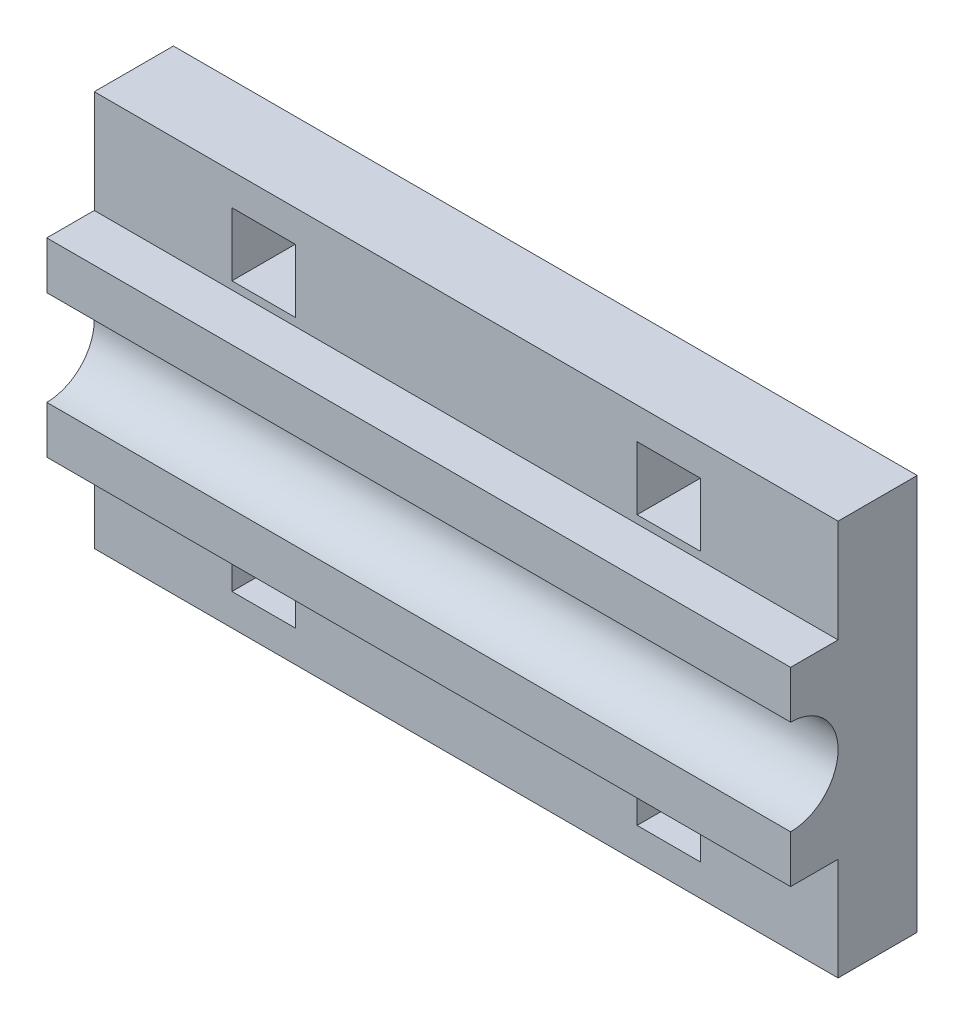
ISO-10303-21;
HEADER;
FILE_DESCRIPTION(('STEP AP214'),'2;1');
FILE_NAME('part.step','',(''),(''),'','','');
FILE_SCHEMA(('AUTOMOTIVE_DESIGN { 1 0 10303 214 1 1 1 1 }'));
ENDSEC;
DATA;
#1=APPLICATION_CONTEXT('core data for automotive mechanical design processes');
#2=APPLICATION_PROTOCOL_DEFINITION('international standard','automotive_design',2000,#1);
#3=PRODUCT_CONTEXT('',#1,'mechanical');
#4=PRODUCT('Part','Part','',(#3));
#5=PRODUCT_RELATED_PRODUCT_CATEGORY('part','',(#4));
#6=PRODUCT_DEFINITION_FORMATION('','',#4);
#7=PRODUCT_DEFINITION_CONTEXT('part definition',#1,'design');
#8=PRODUCT_DEFINITION('design','',#6,#7);
#9=PRODUCT_DEFINITION_SHAPE('','',#8);
#10=(LENGTH_UNIT() NAMED_UNIT(*) SI_UNIT(.MILLI.,.METRE.));
#11=(NAMED_UNIT(*) PLANE_ANGLE_UNIT() SI_UNIT($,.RADIAN.));
#12=(NAMED_UNIT(*) SI_UNIT($,.STERADIAN.) SOLID_ANGLE_UNIT());
#13=UNCERTAINTY_MEASURE_WITH_UNIT(LENGTH_MEASURE(1.E-05),#10,'distance_accuracy_value','');
#14=(GEOMETRIC_REPRESENTATION_CONTEXT(3) GLOBAL_UNCERTAINTY_ASSIGNED_CONTEXT((#13)) GLOBAL_UNIT_ASSIGNED_CONTEXT((#10,
#11,#12)) REPRESENTATION_CONTEXT('',''));
#15=CARTESIAN_POINT('',(0.,0.,0.));
#16=DIRECTION('',(0.,0.,1.));
#17=DIRECTION('',(1.,0.,0.));
#18=AXIS2_PLACEMENT_3D('',#15,#16,#17);
#19=CARTESIAN_POINT('',(0.,0.,8.));
#20=DIRECTION('',(0.,0.,-1.));
#21=DIRECTION('',(-1.,0.,0.));
#22=AXIS2_PLACEMENT_3D('',#19,#20,#21);
#23=PLANE('',#22);
#24=DIRECTION('',(0.,-1.,0.));
#25=VECTOR('',#24,1.);
#26=CARTESIAN_POINT('',(-36.,-13.5,8.));
#27=LINE('',#26,#25);
#28=CARTESIAN_POINT('',(-36.,-1.5,8.));
#29=VERTEX_POINT('',#28);
#30=CARTESIAN_POINT('',(-36.,-4.5,8.));
#31=VERTEX_POINT('',#30);
#32=EDGE_CURVE('E216',#29,#31,#27,.T.);
#33=ORIENTED_EDGE('',*,*,#32,.T.);
#34=DIRECTION('',(1.,0.,0.));
#35=VECTOR('',#34,1.);
#36=CARTESIAN_POINT('',(-52.,-4.5,8.));
#37=LINE('',#36,#35);
#38=CARTESIAN_POINT('',(11.,-4.5,8.));
#39=VERTEX_POINT('',#38);
#40=EDGE_CURVE('E11',#31,#39,#37,.T.);
#41=ORIENTED_EDGE('',*,*,#40,.T.);
#42=DIRECTION('',(0.,1.,0.));
#43=VECTOR('',#42,1.);
#44=CARTESIAN_POINT('',(11.,-13.5,8.));
#45=LINE('',#44,#43);
#46=CARTESIAN_POINT('',(11.,-1.5,8.));
#47=VERTEX_POINT('',#46);
#48=EDGE_CURVE('E213',#39,#47,#45,.T.);
#49=ORIENTED_EDGE('',*,*,#48,.T.);
#50=DIRECTION('',(-1.,0.,0.));
#51=VECTOR('',#50,1.);
#52=CARTESIAN_POINT('',(-36.,-1.5,8.));
#53=LINE('',#52,#51);
#54=EDGE_CURVE('E224',#47,#29,#53,.T.);
#55=ORIENTED_EDGE('',*,*,#54,.T.);
#56=EDGE_LOOP('',(#33,#41,#49,#55));
#57=FACE_BOUND('',#56,.T.);
#58=ADVANCED_FACE('F33',(#57),#23,.F.);
#59=CARTESIAN_POINT('',(0.,0.,5.));
#60=DIRECTION('',(0.,0.,1.));
#61=DIRECTION('',(1.,0.,0.));
#62=AXIS2_PLACEMENT_3D('',#59,#60,#61);
#63=PLANE('',#62);
#64=DIRECTION('',(-1.,0.,0.));
#65=VECTOR('',#64,1.);
#66=CARTESIAN_POINT('',(-36.,-1.5,5.));
#67=LINE('',#66,#65);
#68=CARTESIAN_POINT('',(11.,-1.5,5.));
#69=VERTEX_POINT('',#68);
#70=CARTESIAN_POINT('',(-36.,-1.5,5.));
#71=VERTEX_POINT('',#70);
#72=EDGE_CURVE('E56',#69,#71,#67,.T.);
#73=ORIENTED_EDGE('',*,*,#72,.F.);
#74=DIRECTION('',(0.,1.,0.));
#75=VECTOR('',#74,1.);
#76=CARTESIAN_POINT('',(11.,-20.,5.));
#77=LINE('',#76,#75);
#78=CARTESIAN_POINT('',(11.,5.,5.));
#79=VERTEX_POINT('',#78);
#80=EDGE_CURVE('E382',#69,#79,#77,.T.);
#81=ORIENTED_EDGE('',*,*,#80,.T.);
#82=DIRECTION('',(-1.,0.,0.));
#83=VECTOR('',#82,1.);
#84=CARTESIAN_POINT('',(11.,5.,5.));
#85=LINE('',#84,#83);
#86=CARTESIAN_POINT('',(-36.,4.99999999999999,5.));
#87=VERTEX_POINT('',#86);
#88=EDGE_CURVE('E373',#79,#87,#85,.T.);
#89=ORIENTED_EDGE('',*,*,#88,.T.);
#90=DIRECTION('',(0.,-1.,0.));
#91=VECTOR('',#90,1.);
#92=CARTESIAN_POINT('',(-36.,4.99999999999999,5.));
#93=LINE('',#92,#91);
#94=EDGE_CURVE('E378',#87,#71,#93,.T.);
#95=ORIENTED_EDGE('',*,*,#94,.T.);
#96=EDGE_LOOP('',(#73,#81,#89,#95));
#97=FACE_BOUND('',#96,.T.);
#98=DIRECTION('',(0.,1.,0.));
#99=VECTOR('',#98,1.);
#100=CARTESIAN_POINT('',(2.3,3.,5.));
#101=LINE('',#100,#99);
#102=CARTESIAN_POINT('',(2.3,-1.00000000000001,5.));
#103=VERTEX_POINT('',#102);
#104=CARTESIAN_POINT('',(2.3,3.,5.));
#105=VERTEX_POINT('',#104);
#106=EDGE_CURVE('E293',#103,#105,#101,.T.);
#107=ORIENTED_EDGE('',*,*,#106,.F.);
#108=DIRECTION('',(1.,0.,0.));
#109=VECTOR('',#108,1.);
#110=CARTESIAN_POINT('',(2.3,-1.00000000000001,5.));
#111=LINE('',#110,#109);
#112=CARTESIAN_POINT('',(-1.7,-1.,5.));
#113=VERTEX_POINT('',#112);
#114=EDGE_CURVE('E283',#113,#103,#111,.T.);
#115=ORIENTED_EDGE('',*,*,#114,.F.);
#116=DIRECTION('',(0.,-1.,0.));
#117=VECTOR('',#116,1.);
#118=CARTESIAN_POINT('',(-1.7,3.,5.));
#119=LINE('',#118,#117);
#120=CARTESIAN_POINT('',(-1.7,3.,5.));
#121=VERTEX_POINT('',#120);
#122=EDGE_CURVE('E299',#121,#113,#119,.T.);
#123=ORIENTED_EDGE('',*,*,#122,.F.);
#124=DIRECTION('',(-1.,0.,0.));
#125=VECTOR('',#124,1.);
#126=CARTESIAN_POINT('',(2.3,3.,5.));
#127=LINE('',#126,#125);
#128=EDGE_CURVE('E295',#105,#121,#127,.T.);
#129=ORIENTED_EDGE('',*,*,#128,.F.);
#130=EDGE_LOOP('',(#107,#115,#123,#129));
#131=FACE_BOUND('',#130,.T.);
#132=DIRECTION('',(0.,-1.,0.));
#133=VECTOR('',#132,1.);
#134=CARTESIAN_POINT('',(-27.3,3.,5.));
#135=LINE('',#134,#133);
#136=CARTESIAN_POINT('',(-27.3,3.,5.));
#137=VERTEX_POINT('',#136);
#138=CARTESIAN_POINT('',(-27.3,-1.00000000000001,5.));
#139=VERTEX_POINT('',#138);
#140=EDGE_CURVE('E259',#137,#139,#135,.T.);
#141=ORIENTED_EDGE('',*,*,#140,.F.);
#142=DIRECTION('',(-1.,0.,0.));
#143=VECTOR('',#142,1.);
#144=CARTESIAN_POINT('',(-27.3,3.,5.));
#145=LINE('',#144,#143);
#146=CARTESIAN_POINT('',(-23.3,3.,5.));
#147=VERTEX_POINT('',#146);
#148=EDGE_CURVE('E249',#147,#137,#145,.T.);
#149=ORIENTED_EDGE('',*,*,#148,.F.);
#150=DIRECTION('',(0.,1.,0.));
#151=VECTOR('',#150,1.);
#152=CARTESIAN_POINT('',(-23.3,3.,5.));
#153=LINE('',#152,#151);
#154=CARTESIAN_POINT('',(-23.3,-1.,5.));
#155=VERTEX_POINT('',#154);
#156=EDGE_CURVE('E265',#155,#147,#153,.T.);
#157=ORIENTED_EDGE('',*,*,#156,.F.);
#158=DIRECTION('',(1.,0.,0.));
#159=VECTOR('',#158,1.);
#160=CARTESIAN_POINT('',(-27.3,-1.00000000000001,5.));
#161=LINE('',#160,#159);
#162=EDGE_CURVE('E261',#139,#155,#161,.T.);
#163=ORIENTED_EDGE('',*,*,#162,.F.);
#164=EDGE_LOOP('',(#141,#149,#157,#163));
#165=FACE_BOUND('',#164,.T.);
#166=ADVANCED_FACE('F433',(#97,#131,#165),#63,.T.);
#167=CARTESIAN_POINT('',(11.,5.,5.));
#168=DIRECTION('',(0.,-1.,0.));
#169=DIRECTION('',(1.,0.,0.));
#170=AXIS2_PLACEMENT_3D('',#167,#168,#169);
#171=PLANE('',#170);
#172=DIRECTION('',(-1.,0.,0.));
#173=VECTOR('',#172,1.);
#174=CARTESIAN_POINT('',(11.,5.,0.));
#175=LINE('',#174,#173);
#176=CARTESIAN_POINT('',(11.,5.,0.));
#177=VERTEX_POINT('',#176);
#178=CARTESIAN_POINT('',(-36.,4.99999999999999,0.));
#179=VERTEX_POINT('',#178);
#180=EDGE_CURVE('E366',#177,#179,#175,.T.);
#181=ORIENTED_EDGE('',*,*,#180,.T.);
#182=DIRECTION('',(0.,0.,-1.));
#183=VECTOR('',#182,1.);
#184=CARTESIAN_POINT('',(-36.,4.99999999999999,5.));
#185=LINE('',#184,#183);
#186=EDGE_CURVE('E401',#87,#179,#185,.T.);
#187=ORIENTED_EDGE('',*,*,#186,.F.);
#188=ORIENTED_EDGE('',*,*,#88,.F.);
#189=DIRECTION('',(0.,0.,-1.));
#190=VECTOR('',#189,1.);
#191=CARTESIAN_POINT('',(11.,5.,5.));
#192=LINE('',#191,#190);
#193=EDGE_CURVE('E385',#79,#177,#192,.T.);
#194=ORIENTED_EDGE('',*,*,#193,.T.);
#195=EDGE_LOOP('',(#181,#187,#188,#194));
#196=FACE_BOUND('',#195,.T.);
#197=ADVANCED_FACE('F35',(#196),#171,.F.);
#198=CARTESIAN_POINT('',(-36.,4.99999999999999,5.));
#199=DIRECTION('',(1.,0.,0.));
#200=DIRECTION('',(0.,1.,0.));
#201=AXIS2_PLACEMENT_3D('',#198,#199,#200);
#202=PLANE('',#201);
#203=CARTESIAN_POINT('',(-36.,-10.5,8.));
#204=VERTEX_POINT('',#203);
#205=CARTESIAN_POINT('',(-36.,-13.5,8.));
#206=VERTEX_POINT('',#205);
#207=EDGE_CURVE('E234',#204,#206,#27,.T.);
#208=ORIENTED_EDGE('',*,*,#207,.F.);
#209=CARTESIAN_POINT('',(-36.,-7.5,8.));
#210=DIRECTION('',(1.,0.,0.));
#211=DIRECTION('',(0.,1.,0.));
#212=AXIS2_PLACEMENT_3D('',#209,#210,#211);
#213=CIRCLE('',#212,3.);
#214=EDGE_CURVE('E48',#204,#31,#213,.T.);
#215=ORIENTED_EDGE('',*,*,#214,.T.);
#216=ORIENTED_EDGE('',*,*,#32,.F.);
#217=DIRECTION('',(0.,0.,-1.));
#218=VECTOR('',#217,1.);
#219=CARTESIAN_POINT('',(-36.,-1.5,8.));
#220=LINE('',#219,#218);
#221=EDGE_CURVE('E229',#29,#71,#220,.T.);
#222=ORIENTED_EDGE('',*,*,#221,.T.);
#223=ORIENTED_EDGE('',*,*,#94,.F.);
#224=ORIENTED_EDGE('',*,*,#186,.T.);
#225=DIRECTION('',(0.,-1.,0.));
#226=VECTOR('',#225,1.);
#227=CARTESIAN_POINT('',(-36.,4.99999999999999,0.));
#228=LINE('',#227,#226);
#229=CARTESIAN_POINT('',(-36.,-20.,0.));
#230=VERTEX_POINT('',#229);
#231=EDGE_CURVE('E388',#179,#230,#228,.T.);
#232=ORIENTED_EDGE('',*,*,#231,.T.);
#233=DIRECTION('',(0.,0.,-1.));
#234=VECTOR('',#233,1.);
#235=CARTESIAN_POINT('',(-36.,-20.,5.));
#236=LINE('',#235,#234);
#237=CARTESIAN_POINT('',(-36.,-20.,5.));
#238=VERTEX_POINT('',#237);
#239=EDGE_CURVE('E398',#238,#230,#236,.T.);
#240=ORIENTED_EDGE('',*,*,#239,.F.);
#241=CARTESIAN_POINT('',(-36.,-13.5,5.));
#242=VERTEX_POINT('',#241);
#243=EDGE_CURVE('E376',#242,#238,#93,.T.);
#244=ORIENTED_EDGE('',*,*,#243,.F.);
#245=DIRECTION('',(0.,0.,-1.));
#246=VECTOR('',#245,1.);
#247=CARTESIAN_POINT('',(-36.,-13.5,8.));
#248=LINE('',#247,#246);
#249=EDGE_CURVE('E241',#206,#242,#248,.T.);
#250=ORIENTED_EDGE('',*,*,#249,.F.);
#251=EDGE_LOOP('',(#208,#215,#216,#222,#223,#224,#232,#240,#244,#250));
#252=FACE_BOUND('',#251,.T.);
#253=ADVANCED_FACE('F409',(#252),#202,.F.);
#254=CARTESIAN_POINT('',(-36.,-20.,5.));
#255=DIRECTION('',(0.,1.,0.));
#256=DIRECTION('',(-1.,0.,0.));
#257=AXIS2_PLACEMENT_3D('',#254,#255,#256);
#258=PLANE('',#257);
#259=DIRECTION('',(1.,0.,0.));
#260=VECTOR('',#259,1.);
#261=CARTESIAN_POINT('',(-36.,-20.,0.));
#262=LINE('',#261,#260);
#263=CARTESIAN_POINT('',(11.,-20.,0.));
#264=VERTEX_POINT('',#263);
#265=EDGE_CURVE('E390',#230,#264,#262,.T.);
#266=ORIENTED_EDGE('',*,*,#265,.T.);
#267=DIRECTION('',(0.,0.,-1.));
#268=VECTOR('',#267,1.);
#269=CARTESIAN_POINT('',(11.,-20.,5.));
#270=LINE('',#269,#268);
#271=CARTESIAN_POINT('',(11.,-20.,5.));
#272=VERTEX_POINT('',#271);
#273=EDGE_CURVE('E395',#272,#264,#270,.T.);
#274=ORIENTED_EDGE('',*,*,#273,.F.);
#275=DIRECTION('',(1.,0.,0.));
#276=VECTOR('',#275,1.);
#277=CARTESIAN_POINT('',(-36.,-20.,5.));
#278=LINE('',#277,#276);
#279=EDGE_CURVE('E380',#238,#272,#278,.T.);
#280=ORIENTED_EDGE('',*,*,#279,.F.);
#281=ORIENTED_EDGE('',*,*,#239,.T.);
#282=EDGE_LOOP('',(#266,#274,#280,#281));
#283=FACE_BOUND('',#282,.T.);
#284=ADVANCED_FACE('F424',(#283),#258,.F.);
#285=CARTESIAN_POINT('',(11.,-20.,5.));
#286=DIRECTION('',(-1.,0.,0.));
#287=DIRECTION('',(0.,-1.,0.));
#288=AXIS2_PLACEMENT_3D('',#285,#286,#287);
#289=PLANE('',#288);
#290=ORIENTED_EDGE('',*,*,#48,.F.);
#291=CARTESIAN_POINT('',(11.,-7.5,8.));
#292=DIRECTION('',(1.,0.,0.));
#293=DIRECTION('',(0.,1.,0.));
#294=AXIS2_PLACEMENT_3D('',#291,#292,#293);
#295=CIRCLE('',#294,3.);
#296=CARTESIAN_POINT('',(11.,-10.5,8.));
#297=VERTEX_POINT('',#296);
#298=EDGE_CURVE('E204',#297,#39,#295,.T.);
#299=ORIENTED_EDGE('',*,*,#298,.F.);
#300=CARTESIAN_POINT('',(11.,-13.5,8.));
#301=VERTEX_POINT('',#300);
#302=EDGE_CURVE('E221',#301,#297,#45,.T.);
#303=ORIENTED_EDGE('',*,*,#302,.F.);
#304=DIRECTION('',(0.,0.,-1.));
#305=VECTOR('',#304,1.);
#306=CARTESIAN_POINT('',(11.,-13.5,8.));
#307=LINE('',#306,#305);
#308=CARTESIAN_POINT('',(11.,-13.5,5.));
#309=VERTEX_POINT('',#308);
#310=EDGE_CURVE('E238',#301,#309,#307,.T.);
#311=ORIENTED_EDGE('',*,*,#310,.T.);
#312=EDGE_CURVE('E383',#272,#309,#77,.T.);
#313=ORIENTED_EDGE('',*,*,#312,.F.);
#314=ORIENTED_EDGE('',*,*,#273,.T.);
#315=DIRECTION('',(0.,1.,0.));
#316=VECTOR('',#315,1.);
#317=CARTESIAN_POINT('',(11.,-20.,0.));
#318=LINE('',#317,#316);
#319=EDGE_CURVE('E377',#264,#177,#318,.T.);
#320=ORIENTED_EDGE('',*,*,#319,.T.);
#321=ORIENTED_EDGE('',*,*,#193,.F.);
#322=ORIENTED_EDGE('',*,*,#80,.F.);
#323=DIRECTION('',(0.,0.,-1.));
#324=VECTOR('',#323,1.);
#325=CARTESIAN_POINT('',(11.,-1.5,8.));
#326=LINE('',#325,#324);
#327=EDGE_CURVE('E219',#47,#69,#326,.T.);
#328=ORIENTED_EDGE('',*,*,#327,.F.);
#329=EDGE_LOOP('',(#290,#299,#303,#311,#313,#314,#320,#321,#322,#328));
#330=FACE_BOUND('',#329,.T.);
#331=ADVANCED_FACE('F217',(#330),#289,.F.);
#332=DIRECTION('',(1.,0.,0.));
#333=VECTOR('',#332,1.);
#334=CARTESIAN_POINT('',(-36.,-13.5,5.));
#335=LINE('',#334,#333);
#336=EDGE_CURVE('E230',#242,#309,#335,.T.);
#337=ORIENTED_EDGE('',*,*,#336,.F.);
#338=ORIENTED_EDGE('',*,*,#243,.T.);
#339=ORIENTED_EDGE('',*,*,#279,.T.);
#340=ORIENTED_EDGE('',*,*,#312,.T.);
#341=EDGE_LOOP('',(#337,#338,#339,#340));
#342=FACE_BOUND('',#341,.T.);
#343=DIRECTION('',(1.,0.,0.));
#344=VECTOR('',#343,1.);
#345=CARTESIAN_POINT('',(2.30000000000001,-18.,5.));
#346=LINE('',#345,#344);
#347=CARTESIAN_POINT('',(-1.69999999999999,-18.,5.));
#348=VERTEX_POINT('',#347);
#349=CARTESIAN_POINT('',(2.30000000000001,-18.,5.));
#350=VERTEX_POINT('',#349);
#351=EDGE_CURVE('E244',#348,#350,#346,.T.);
#352=ORIENTED_EDGE('',*,*,#351,.F.);
#353=DIRECTION('',(0.,-1.,0.));
#354=VECTOR('',#353,1.);
#355=CARTESIAN_POINT('',(-1.69999999999999,-18.,5.));
#356=LINE('',#355,#354);
#357=CARTESIAN_POINT('',(-1.7,-14.,5.));
#358=VERTEX_POINT('',#357);
#359=EDGE_CURVE('E315',#358,#348,#356,.T.);
#360=ORIENTED_EDGE('',*,*,#359,.F.);
#361=DIRECTION('',(-1.,0.,0.));
#362=VECTOR('',#361,1.);
#363=CARTESIAN_POINT('',(2.3,-14.,5.));
#364=LINE('',#363,#362);
#365=CARTESIAN_POINT('',(2.3,-14.,5.));
#366=VERTEX_POINT('',#365);
#367=EDGE_CURVE('E329',#366,#358,#364,.T.);
#368=ORIENTED_EDGE('',*,*,#367,.F.);
#369=DIRECTION('',(0.,1.,0.));
#370=VECTOR('',#369,1.);
#371=CARTESIAN_POINT('',(2.30000000000001,-18.,5.));
#372=LINE('',#371,#370);
#373=EDGE_CURVE('E326',#350,#366,#372,.T.);
#374=ORIENTED_EDGE('',*,*,#373,.F.);
#375=EDGE_LOOP('',(#352,#360,#368,#374));
#376=FACE_BOUND('',#375,.T.);
#377=DIRECTION('',(0.,-1.,0.));
#378=VECTOR('',#377,1.);
#379=CARTESIAN_POINT('',(-27.3,-18.,5.));
#380=LINE('',#379,#378);
#381=CARTESIAN_POINT('',(-27.3,-14.,5.));
#382=VERTEX_POINT('',#381);
#383=CARTESIAN_POINT('',(-27.3,-18.,5.));
#384=VERTEX_POINT('',#383);
#385=EDGE_CURVE('E272',#382,#384,#380,.T.);
#386=ORIENTED_EDGE('',*,*,#385,.F.);
#387=DIRECTION('',(-1.,0.,0.));
#388=VECTOR('',#387,1.);
#389=CARTESIAN_POINT('',(-27.3,-14.,5.));
#390=LINE('',#389,#388);
#391=CARTESIAN_POINT('',(-23.3,-14.,5.));
#392=VERTEX_POINT('',#391);
#393=EDGE_CURVE('E345',#392,#382,#390,.T.);
#394=ORIENTED_EDGE('',*,*,#393,.F.);
#395=DIRECTION('',(0.,1.,0.));
#396=VECTOR('',#395,1.);
#397=CARTESIAN_POINT('',(-23.3,-18.,5.));
#398=LINE('',#397,#396);
#399=CARTESIAN_POINT('',(-23.3,-18.,5.));
#400=VERTEX_POINT('',#399);
#401=EDGE_CURVE('E359',#400,#392,#398,.T.);
#402=ORIENTED_EDGE('',*,*,#401,.F.);
#403=DIRECTION('',(1.,0.,0.));
#404=VECTOR('',#403,1.);
#405=CARTESIAN_POINT('',(-27.3,-18.,5.));
#406=LINE('',#405,#404);
#407=EDGE_CURVE('E356',#384,#400,#406,.T.);
#408=ORIENTED_EDGE('',*,*,#407,.F.);
#409=EDGE_LOOP('',(#386,#394,#402,#408));
#410=FACE_BOUND('',#409,.T.);
#411=ADVANCED_FACE('F420',(#342,#376,#410),#63,.T.);
#412=CARTESIAN_POINT('',(0.,0.,0.));
#413=DIRECTION('',(0.,0.,1.));
#414=DIRECTION('',(1.,0.,0.));
#415=AXIS2_PLACEMENT_3D('',#412,#413,#414);
#416=PLANE('',#415);
#417=DIRECTION('',(-1.,0.,0.));
#418=VECTOR('',#417,1.);
#419=CARTESIAN_POINT('',(-27.3,3.,0.));
#420=LINE('',#419,#418);
#421=CARTESIAN_POINT('',(-23.3,3.,0.));
#422=VERTEX_POINT('',#421);
#423=CARTESIAN_POINT('',(-27.3,3.,0.));
#424=VERTEX_POINT('',#423);
#425=EDGE_CURVE('E255',#422,#424,#420,.T.);
#426=ORIENTED_EDGE('',*,*,#425,.T.);
#427=DIRECTION('',(0.,-1.,0.));
#428=VECTOR('',#427,1.);
#429=CARTESIAN_POINT('',(-27.3,3.,0.));
#430=LINE('',#429,#428);
#431=CARTESIAN_POINT('',(-27.3,-1.00000000000001,0.));
#432=VERTEX_POINT('',#431);
#433=EDGE_CURVE('E245',#424,#432,#430,.T.);
#434=ORIENTED_EDGE('',*,*,#433,.T.);
#435=DIRECTION('',(1.,0.,0.));
#436=VECTOR('',#435,1.);
#437=CARTESIAN_POINT('',(-27.3,-1.00000000000001,0.));
#438=LINE('',#437,#436);
#439=CARTESIAN_POINT('',(-23.3,-1.,0.));
#440=VERTEX_POINT('',#439);
#441=EDGE_CURVE('E248',#432,#440,#438,.T.);
#442=ORIENTED_EDGE('',*,*,#441,.T.);
#443=DIRECTION('',(0.,1.,0.));
#444=VECTOR('',#443,1.);
#445=CARTESIAN_POINT('',(-23.3,3.,0.));
#446=LINE('',#445,#444);
#447=EDGE_CURVE('E252',#440,#422,#446,.T.);
#448=ORIENTED_EDGE('',*,*,#447,.T.);
#449=EDGE_LOOP('',(#426,#434,#442,#448));
#450=FACE_BOUND('',#449,.T.);
#451=DIRECTION('',(1.,0.,0.));
#452=VECTOR('',#451,1.);
#453=CARTESIAN_POINT('',(2.3,-1.00000000000001,0.));
#454=LINE('',#453,#452);
#455=CARTESIAN_POINT('',(-1.7,-1.,0.));
#456=VERTEX_POINT('',#455);
#457=CARTESIAN_POINT('',(2.3,-1.00000000000001,0.));
#458=VERTEX_POINT('',#457);
#459=EDGE_CURVE('E289',#456,#458,#454,.T.);
#460=ORIENTED_EDGE('',*,*,#459,.T.);
#461=DIRECTION('',(0.,1.,0.));
#462=VECTOR('',#461,1.);
#463=CARTESIAN_POINT('',(2.3,3.,0.));
#464=LINE('',#463,#462);
#465=CARTESIAN_POINT('',(2.3,3.,0.));
#466=VERTEX_POINT('',#465);
#467=EDGE_CURVE('E279',#458,#466,#464,.T.);
#468=ORIENTED_EDGE('',*,*,#467,.T.);
#469=DIRECTION('',(-1.,0.,0.));
#470=VECTOR('',#469,1.);
#471=CARTESIAN_POINT('',(2.3,3.,0.));
#472=LINE('',#471,#470);
#473=CARTESIAN_POINT('',(-1.7,3.,0.));
#474=VERTEX_POINT('',#473);
#475=EDGE_CURVE('E282',#466,#474,#472,.T.);
#476=ORIENTED_EDGE('',*,*,#475,.T.);
#477=DIRECTION('',(0.,-1.,0.));
#478=VECTOR('',#477,1.);
#479=CARTESIAN_POINT('',(-1.7,3.,0.));
#480=LINE('',#479,#478);
#481=EDGE_CURVE('E286',#474,#456,#480,.T.);
#482=ORIENTED_EDGE('',*,*,#481,.T.);
#483=EDGE_LOOP('',(#460,#468,#476,#482));
#484=FACE_BOUND('',#483,.T.);
#485=DIRECTION('',(0.,-1.,0.));
#486=VECTOR('',#485,1.);
#487=CARTESIAN_POINT('',(-1.69999999999999,-18.,0.));
#488=LINE('',#487,#486);
#489=CARTESIAN_POINT('',(-1.7,-14.,0.));
#490=VERTEX_POINT('',#489);
#491=CARTESIAN_POINT('',(-1.69999999999999,-18.,0.));
#492=VERTEX_POINT('',#491);
#493=EDGE_CURVE('E321',#490,#492,#488,.T.);
#494=ORIENTED_EDGE('',*,*,#493,.T.);
#495=DIRECTION('',(1.,0.,0.));
#496=VECTOR('',#495,1.);
#497=CARTESIAN_POINT('',(2.30000000000001,-18.,0.));
#498=LINE('',#497,#496);
#499=CARTESIAN_POINT('',(2.30000000000001,-18.,0.));
#500=VERTEX_POINT('',#499);
#501=EDGE_CURVE('E311',#492,#500,#498,.T.);
#502=ORIENTED_EDGE('',*,*,#501,.T.);
#503=DIRECTION('',(0.,1.,0.));
#504=VECTOR('',#503,1.);
#505=CARTESIAN_POINT('',(2.30000000000001,-18.,0.));
#506=LINE('',#505,#504);
#507=CARTESIAN_POINT('',(2.3,-14.,0.));
#508=VERTEX_POINT('',#507);
#509=EDGE_CURVE('E314',#500,#508,#506,.T.);
#510=ORIENTED_EDGE('',*,*,#509,.T.);
#511=DIRECTION('',(-1.,0.,0.));
#512=VECTOR('',#511,1.);
#513=CARTESIAN_POINT('',(2.3,-14.,0.));
#514=LINE('',#513,#512);
#515=EDGE_CURVE('E318',#508,#490,#514,.T.);
#516=ORIENTED_EDGE('',*,*,#515,.T.);
#517=EDGE_LOOP('',(#494,#502,#510,#516));
#518=FACE_BOUND('',#517,.T.);
#519=DIRECTION('',(-1.,0.,0.));
#520=VECTOR('',#519,1.);
#521=CARTESIAN_POINT('',(-27.3,-14.,0.));
#522=LINE('',#521,#520);
#523=CARTESIAN_POINT('',(-23.3,-14.,0.));
#524=VERTEX_POINT('',#523);
#525=CARTESIAN_POINT('',(-27.3,-14.,0.));
#526=VERTEX_POINT('',#525);
#527=EDGE_CURVE('E351',#524,#526,#522,.T.);
#528=ORIENTED_EDGE('',*,*,#527,.T.);
#529=DIRECTION('',(0.,-1.,0.));
#530=VECTOR('',#529,1.);
#531=CARTESIAN_POINT('',(-27.3,-18.,0.));
#532=LINE('',#531,#530);
#533=CARTESIAN_POINT('',(-27.3,-18.,0.));
#534=VERTEX_POINT('',#533);
#535=EDGE_CURVE('E341',#526,#534,#532,.T.);
#536=ORIENTED_EDGE('',*,*,#535,.T.);
#537=DIRECTION('',(1.,0.,0.));
#538=VECTOR('',#537,1.);
#539=CARTESIAN_POINT('',(-27.3,-18.,0.));
#540=LINE('',#539,#538);
#541=CARTESIAN_POINT('',(-23.3,-18.,0.));
#542=VERTEX_POINT('',#541);
#543=EDGE_CURVE('E344',#534,#542,#540,.T.);
#544=ORIENTED_EDGE('',*,*,#543,.T.);
#545=DIRECTION('',(0.,1.,0.));
#546=VECTOR('',#545,1.);
#547=CARTESIAN_POINT('',(-23.3,-18.,0.));
#548=LINE('',#547,#546);
#549=EDGE_CURVE('E348',#542,#524,#548,.T.);
#550=ORIENTED_EDGE('',*,*,#549,.T.);
#551=EDGE_LOOP('',(#528,#536,#544,#550));
#552=FACE_BOUND('',#551,.T.);
#553=ORIENTED_EDGE('',*,*,#180,.F.);
#554=ORIENTED_EDGE('',*,*,#319,.F.);
#555=ORIENTED_EDGE('',*,*,#265,.F.);
#556=ORIENTED_EDGE('',*,*,#231,.F.);
#557=EDGE_LOOP('',(#553,#554,#555,#556));
#558=FACE_BOUND('',#557,.T.);
#559=ADVANCED_FACE('F428',(#450,#484,#518,#552,#558),#416,.F.);
#560=CARTESIAN_POINT('',(-27.3,-18.,0.));
#561=DIRECTION('',(-1.,0.,0.));
#562=DIRECTION('',(0.,0.,1.));
#563=AXIS2_PLACEMENT_3D('',#560,#561,#562);
#564=PLANE('',#563);
#565=ORIENTED_EDGE('',*,*,#385,.T.);
#566=DIRECTION('',(0.,0.,1.));
#567=VECTOR('',#566,1.);
#568=CARTESIAN_POINT('',(-27.3,-18.,0.));
#569=LINE('',#568,#567);
#570=EDGE_CURVE('E354',#534,#384,#569,.T.);
#571=ORIENTED_EDGE('',*,*,#570,.F.);
#572=ORIENTED_EDGE('',*,*,#535,.F.);
#573=DIRECTION('',(0.,0.,1.));
#574=VECTOR('',#573,1.);
#575=CARTESIAN_POINT('',(-27.3,-14.,0.));
#576=LINE('',#575,#574);
#577=EDGE_CURVE('E364',#526,#382,#576,.T.);
#578=ORIENTED_EDGE('',*,*,#577,.T.);
#579=EDGE_LOOP('',(#565,#571,#572,#578));
#580=FACE_BOUND('',#579,.T.);
#581=ADVANCED_FACE('F652',(#580),#564,.F.);
#582=CARTESIAN_POINT('',(-27.3,-14.,0.));
#583=DIRECTION('',(0.,1.,0.));
#584=DIRECTION('',(0.,0.,1.));
#585=AXIS2_PLACEMENT_3D('',#582,#583,#584);
#586=PLANE('',#585);
#587=ORIENTED_EDGE('',*,*,#393,.T.);
#588=ORIENTED_EDGE('',*,*,#577,.F.);
#589=ORIENTED_EDGE('',*,*,#527,.F.);
#590=DIRECTION('',(0.,0.,1.));
#591=VECTOR('',#590,1.);
#592=CARTESIAN_POINT('',(-23.3,-14.,0.));
#593=LINE('',#592,#591);
#594=EDGE_CURVE('E367',#524,#392,#593,.T.);
#595=ORIENTED_EDGE('',*,*,#594,.T.);
#596=EDGE_LOOP('',(#587,#588,#589,#595));
#597=FACE_BOUND('',#596,.T.);
#598=ADVANCED_FACE('F642',(#597),#586,.F.);
#599=CARTESIAN_POINT('',(-23.3,-18.,0.));
#600=DIRECTION('',(1.,0.,0.));
#601=DIRECTION('',(0.,0.,-1.));
#602=AXIS2_PLACEMENT_3D('',#599,#600,#601);
#603=PLANE('',#602);
#604=ORIENTED_EDGE('',*,*,#401,.T.);
#605=ORIENTED_EDGE('',*,*,#594,.F.);
#606=ORIENTED_EDGE('',*,*,#549,.F.);
#607=DIRECTION('',(0.,0.,1.));
#608=VECTOR('',#607,1.);
#609=CARTESIAN_POINT('',(-23.3,-18.,0.));
#610=LINE('',#609,#608);
#611=EDGE_CURVE('E369',#542,#400,#610,.T.);
#612=ORIENTED_EDGE('',*,*,#611,.T.);
#613=EDGE_LOOP('',(#604,#605,#606,#612));
#614=FACE_BOUND('',#613,.T.);
#615=ADVANCED_FACE('F632',(#614),#603,.F.);
#616=CARTESIAN_POINT('',(-27.3,-18.,0.));
#617=DIRECTION('',(0.,-1.,0.));
#618=DIRECTION('',(0.,0.,-1.));
#619=AXIS2_PLACEMENT_3D('',#616,#617,#618);
#620=PLANE('',#619);
#621=ORIENTED_EDGE('',*,*,#407,.T.);
#622=ORIENTED_EDGE('',*,*,#611,.F.);
#623=ORIENTED_EDGE('',*,*,#543,.F.);
#624=ORIENTED_EDGE('',*,*,#570,.T.);
#625=EDGE_LOOP('',(#621,#622,#623,#624));
#626=FACE_BOUND('',#625,.T.);
#627=ADVANCED_FACE('F622',(#626),#620,.F.);
#628=CARTESIAN_POINT('',(2.30000000000001,-18.,0.));
#629=DIRECTION('',(0.,-1.,0.));
#630=DIRECTION('',(1.,0.,0.));
#631=AXIS2_PLACEMENT_3D('',#628,#629,#630);
#632=PLANE('',#631);
#633=ORIENTED_EDGE('',*,*,#351,.T.);
#634=DIRECTION('',(0.,0.,1.));
#635=VECTOR('',#634,1.);
#636=CARTESIAN_POINT('',(2.30000000000001,-18.,0.));
#637=LINE('',#636,#635);
#638=EDGE_CURVE('E324',#500,#350,#637,.T.);
#639=ORIENTED_EDGE('',*,*,#638,.F.);
#640=ORIENTED_EDGE('',*,*,#501,.F.);
#641=DIRECTION('',(0.,0.,1.));
#642=VECTOR('',#641,1.);
#643=CARTESIAN_POINT('',(-1.69999999999999,-18.,0.));
#644=LINE('',#643,#642);
#645=EDGE_CURVE('E296',#492,#348,#644,.T.);
#646=ORIENTED_EDGE('',*,*,#645,.T.);
#647=EDGE_LOOP('',(#633,#639,#640,#646));
#648=FACE_BOUND('',#647,.T.);
#649=ADVANCED_FACE('F612',(#648),#632,.F.);
#650=CARTESIAN_POINT('',(-1.69999999999999,-18.,0.));
#651=DIRECTION('',(-1.,0.,0.));
#652=DIRECTION('',(0.,-1.,0.));
#653=AXIS2_PLACEMENT_3D('',#650,#651,#652);
#654=PLANE('',#653);
#655=ORIENTED_EDGE('',*,*,#359,.T.);
#656=ORIENTED_EDGE('',*,*,#645,.F.);
#657=ORIENTED_EDGE('',*,*,#493,.F.);
#658=DIRECTION('',(0.,0.,1.));
#659=VECTOR('',#658,1.);
#660=CARTESIAN_POINT('',(-1.7,-14.,0.));
#661=LINE('',#660,#659);
#662=EDGE_CURVE('E335',#490,#358,#661,.T.);
#663=ORIENTED_EDGE('',*,*,#662,.T.);
#664=EDGE_LOOP('',(#655,#656,#657,#663));
#665=FACE_BOUND('',#664,.T.);
#666=ADVANCED_FACE('F602',(#665),#654,.F.);
#667=CARTESIAN_POINT('',(2.3,-14.,0.));
#668=DIRECTION('',(0.,1.,0.));
#669=DIRECTION('',(-1.,0.,0.));
#670=AXIS2_PLACEMENT_3D('',#667,#668,#669);
#671=PLANE('',#670);
#672=ORIENTED_EDGE('',*,*,#367,.T.);
#673=ORIENTED_EDGE('',*,*,#662,.F.);
#674=ORIENTED_EDGE('',*,*,#515,.F.);
#675=DIRECTION('',(0.,0.,1.));
#676=VECTOR('',#675,1.);
#677=CARTESIAN_POINT('',(2.3,-14.,0.));
#678=LINE('',#677,#676);
#679=EDGE_CURVE('E337',#508,#366,#678,.T.);
#680=ORIENTED_EDGE('',*,*,#679,.T.);
#681=EDGE_LOOP('',(#672,#673,#674,#680));
#682=FACE_BOUND('',#681,.T.);
#683=ADVANCED_FACE('F592',(#682),#671,.F.);
#684=CARTESIAN_POINT('',(2.30000000000001,-18.,0.));
#685=DIRECTION('',(1.,0.,0.));
#686=DIRECTION('',(0.,1.,0.));
#687=AXIS2_PLACEMENT_3D('',#684,#685,#686);
#688=PLANE('',#687);
#689=ORIENTED_EDGE('',*,*,#373,.T.);
#690=ORIENTED_EDGE('',*,*,#679,.F.);
#691=ORIENTED_EDGE('',*,*,#509,.F.);
#692=ORIENTED_EDGE('',*,*,#638,.T.);
#693=EDGE_LOOP('',(#689,#690,#691,#692));
#694=FACE_BOUND('',#693,.T.);
#695=ADVANCED_FACE('F582',(#694),#688,.F.);
#696=CARTESIAN_POINT('',(2.3,3.,0.));
#697=DIRECTION('',(1.,0.,0.));
#698=DIRECTION('',(0.,1.,0.));
#699=AXIS2_PLACEMENT_3D('',#696,#697,#698);
#700=PLANE('',#699);
#701=ORIENTED_EDGE('',*,*,#106,.T.);
#702=DIRECTION('',(0.,0.,1.));
#703=VECTOR('',#702,1.);
#704=CARTESIAN_POINT('',(2.3,3.,0.));
#705=LINE('',#704,#703);
#706=EDGE_CURVE('E292',#466,#105,#705,.T.);
#707=ORIENTED_EDGE('',*,*,#706,.F.);
#708=ORIENTED_EDGE('',*,*,#467,.F.);
#709=DIRECTION('',(0.,0.,1.));
#710=VECTOR('',#709,1.);
#711=CARTESIAN_POINT('',(2.3,-1.00000000000001,0.));
#712=LINE('',#711,#710);
#713=EDGE_CURVE('E262',#458,#103,#712,.T.);
#714=ORIENTED_EDGE('',*,*,#713,.T.);
#715=EDGE_LOOP('',(#701,#707,#708,#714));
#716=FACE_BOUND('',#715,.T.);
#717=ADVANCED_FACE('F572',(#716),#700,.F.);
#718=CARTESIAN_POINT('',(2.3,-1.00000000000001,0.));
#719=DIRECTION('',(0.,-1.,0.));
#720=DIRECTION('',(1.,0.,0.));
#721=AXIS2_PLACEMENT_3D('',#718,#719,#720);
#722=PLANE('',#721);
#723=ORIENTED_EDGE('',*,*,#114,.T.);
#724=ORIENTED_EDGE('',*,*,#713,.F.);
#725=ORIENTED_EDGE('',*,*,#459,.F.);
#726=DIRECTION('',(0.,0.,1.));
#727=VECTOR('',#726,1.);
#728=CARTESIAN_POINT('',(-1.7,-1.,0.));
#729=LINE('',#728,#727);
#730=EDGE_CURVE('E305',#456,#113,#729,.T.);
#731=ORIENTED_EDGE('',*,*,#730,.T.);
#732=EDGE_LOOP('',(#723,#724,#725,#731));
#733=FACE_BOUND('',#732,.T.);
#734=ADVANCED_FACE('F562',(#733),#722,.F.);
#735=CARTESIAN_POINT('',(-1.7,3.,0.));
#736=DIRECTION('',(-1.,0.,0.));
#737=DIRECTION('',(0.,-1.,0.));
#738=AXIS2_PLACEMENT_3D('',#735,#736,#737);
#739=PLANE('',#738);
#740=ORIENTED_EDGE('',*,*,#122,.T.);
#741=ORIENTED_EDGE('',*,*,#730,.F.);
#742=ORIENTED_EDGE('',*,*,#481,.F.);
#743=DIRECTION('',(0.,0.,1.));
#744=VECTOR('',#743,1.);
#745=CARTESIAN_POINT('',(-1.7,3.,0.));
#746=LINE('',#745,#744);
#747=EDGE_CURVE('E307',#474,#121,#746,.T.);
#748=ORIENTED_EDGE('',*,*,#747,.T.);
#749=EDGE_LOOP('',(#740,#741,#742,#748));
#750=FACE_BOUND('',#749,.T.);
#751=ADVANCED_FACE('F552',(#750),#739,.F.);
#752=CARTESIAN_POINT('',(2.3,3.,0.));
#753=DIRECTION('',(0.,1.,0.));
#754=DIRECTION('',(0.,0.,1.));
#755=AXIS2_PLACEMENT_3D('',#752,#753,#754);
#756=PLANE('',#755);
#757=ORIENTED_EDGE('',*,*,#128,.T.);
#758=ORIENTED_EDGE('',*,*,#747,.F.);
#759=ORIENTED_EDGE('',*,*,#475,.F.);
#760=ORIENTED_EDGE('',*,*,#706,.T.);
#761=EDGE_LOOP('',(#757,#758,#759,#760));
#762=FACE_BOUND('',#761,.T.);
#763=ADVANCED_FACE('F542',(#762),#756,.F.);
#764=CARTESIAN_POINT('',(-27.3,3.,0.));
#765=DIRECTION('',(-1.,0.,0.));
#766=DIRECTION('',(0.,-1.,0.));
#767=AXIS2_PLACEMENT_3D('',#764,#765,#766);
#768=PLANE('',#767);
#769=ORIENTED_EDGE('',*,*,#140,.T.);
#770=DIRECTION('',(0.,0.,1.));
#771=VECTOR('',#770,1.);
#772=CARTESIAN_POINT('',(-27.3,-1.00000000000001,0.));
#773=LINE('',#772,#771);
#774=EDGE_CURVE('E258',#432,#139,#773,.T.);
#775=ORIENTED_EDGE('',*,*,#774,.F.);
#776=ORIENTED_EDGE('',*,*,#433,.F.);
#777=DIRECTION('',(0.,0.,1.));
#778=VECTOR('',#777,1.);
#779=CARTESIAN_POINT('',(-27.3,3.,0.));
#780=LINE('',#779,#778);
#781=EDGE_CURVE('E270',#424,#137,#780,.T.);
#782=ORIENTED_EDGE('',*,*,#781,.T.);
#783=EDGE_LOOP('',(#769,#775,#776,#782));
#784=FACE_BOUND('',#783,.T.);
#785=ADVANCED_FACE('F532',(#784),#768,.F.);
#786=CARTESIAN_POINT('',(-27.3,3.,0.));
#787=DIRECTION('',(0.,1.,0.));
#788=DIRECTION('',(0.,0.,1.));
#789=AXIS2_PLACEMENT_3D('',#786,#787,#788);
#790=PLANE('',#789);
#791=ORIENTED_EDGE('',*,*,#148,.T.);
#792=ORIENTED_EDGE('',*,*,#781,.F.);
#793=ORIENTED_EDGE('',*,*,#425,.F.);
#794=DIRECTION('',(0.,0.,1.));
#795=VECTOR('',#794,1.);
#796=CARTESIAN_POINT('',(-23.3,3.,0.));
#797=LINE('',#796,#795);
#798=EDGE_CURVE('E273',#422,#147,#797,.T.);
#799=ORIENTED_EDGE('',*,*,#798,.T.);
#800=EDGE_LOOP('',(#791,#792,#793,#799));
#801=FACE_BOUND('',#800,.T.);
#802=ADVANCED_FACE('F522',(#801),#790,.F.);
#803=CARTESIAN_POINT('',(-23.3,3.,0.));
#804=DIRECTION('',(1.,0.,0.));
#805=DIRECTION('',(0.,1.,0.));
#806=AXIS2_PLACEMENT_3D('',#803,#804,#805);
#807=PLANE('',#806);
#808=ORIENTED_EDGE('',*,*,#156,.T.);
#809=ORIENTED_EDGE('',*,*,#798,.F.);
#810=ORIENTED_EDGE('',*,*,#447,.F.);
#811=DIRECTION('',(0.,0.,1.));
#812=VECTOR('',#811,1.);
#813=CARTESIAN_POINT('',(-23.3,-1.,0.));
#814=LINE('',#813,#812);
#815=EDGE_CURVE('E275',#440,#155,#814,.T.);
#816=ORIENTED_EDGE('',*,*,#815,.T.);
#817=EDGE_LOOP('',(#808,#809,#810,#816));
#818=FACE_BOUND('',#817,.T.);
#819=ADVANCED_FACE('F512',(#818),#807,.F.);
#820=CARTESIAN_POINT('',(-27.3,-1.00000000000001,0.));
#821=DIRECTION('',(0.,-1.,0.));
#822=DIRECTION('',(1.,0.,0.));
#823=AXIS2_PLACEMENT_3D('',#820,#821,#822);
#824=PLANE('',#823);
#825=ORIENTED_EDGE('',*,*,#162,.T.);
#826=ORIENTED_EDGE('',*,*,#815,.F.);
#827=ORIENTED_EDGE('',*,*,#441,.F.);
#828=ORIENTED_EDGE('',*,*,#774,.T.);
#829=EDGE_LOOP('',(#825,#826,#827,#828));
#830=FACE_BOUND('',#829,.T.);
#831=ADVANCED_FACE('F445',(#830),#824,.F.);
#832=CARTESIAN_POINT('',(-36.,-13.5,8.));
#833=DIRECTION('',(0.,1.,0.));
#834=DIRECTION('',(0.,0.,1.));
#835=AXIS2_PLACEMENT_3D('',#832,#833,#834);
#836=PLANE('',#835);
#837=ORIENTED_EDGE('',*,*,#336,.T.);
#838=ORIENTED_EDGE('',*,*,#310,.F.);
#839=DIRECTION('',(1.,0.,0.));
#840=VECTOR('',#839,1.);
#841=CARTESIAN_POINT('',(-36.,-13.5,8.));
#842=LINE('',#841,#840);
#843=EDGE_CURVE('E222',#206,#301,#842,.T.);
#844=ORIENTED_EDGE('',*,*,#843,.F.);
#845=ORIENTED_EDGE('',*,*,#249,.T.);
#846=EDGE_LOOP('',(#837,#838,#844,#845));
#847=FACE_BOUND('',#846,.T.);
#848=ADVANCED_FACE('F414',(#847),#836,.F.);
#849=CARTESIAN_POINT('',(-36.,-1.5,8.));
#850=DIRECTION('',(0.,-1.,0.));
#851=DIRECTION('',(1.,0.,0.));
#852=AXIS2_PLACEMENT_3D('',#849,#850,#851);
#853=PLANE('',#852);
#854=ORIENTED_EDGE('',*,*,#72,.T.);
#855=ORIENTED_EDGE('',*,*,#221,.F.);
#856=ORIENTED_EDGE('',*,*,#54,.F.);
#857=ORIENTED_EDGE('',*,*,#327,.T.);
#858=EDGE_LOOP('',(#854,#855,#856,#857));
#859=FACE_BOUND('',#858,.T.);
#860=ADVANCED_FACE('F436',(#859),#853,.F.);
#861=ORIENTED_EDGE('',*,*,#302,.T.);
#862=DIRECTION('',(1.,0.,0.));
#863=VECTOR('',#862,1.);
#864=CARTESIAN_POINT('',(-52.,-10.5,8.));
#865=LINE('',#864,#863);
#866=EDGE_CURVE('E41',#297,#204,#865,.F.);
#867=ORIENTED_EDGE('',*,*,#866,.T.);
#868=ORIENTED_EDGE('',*,*,#207,.T.);
#869=ORIENTED_EDGE('',*,*,#843,.T.);
#870=EDGE_LOOP('',(#861,#867,#868,#869));
#871=FACE_BOUND('',#870,.T.);
#872=ADVANCED_FACE('F405',(#871),#23,.F.);
#873=CARTESIAN_POINT('',(-52.,-7.5,8.));
#874=DIRECTION('',(1.,0.,0.));
#875=DIRECTION('',(0.,1.,0.));
#876=AXIS2_PLACEMENT_3D('',#873,#874,#875);
#877=CYLINDRICAL_SURFACE('',#876,3.);
#878=ORIENTED_EDGE('',*,*,#214,.F.);
#879=ORIENTED_EDGE('',*,*,#866,.F.);
#880=ORIENTED_EDGE('',*,*,#298,.T.);
#881=ORIENTED_EDGE('',*,*,#40,.F.);
#882=EDGE_LOOP('',(#878,#879,#880,#881));
#883=FACE_BOUND('',#882,.T.);
#884=ADVANCED_FACE('F205',(#883),#877,.F.);
#885=CLOSED_SHELL('',(#58,#166,#197,#253,#284,#331,#411,#559,#581,#598,#615,#627,#649,#666,#683,
#695,#717,#734,#751,#763,#785,#802,#819,#831,#848,#860,#872,#884));
#886=MANIFOLD_SOLID_BREP('B2',#885);
#887=ADVANCED_BREP_SHAPE_REPRESENTATION('',(#18,#886),#14);
#888=SHAPE_DEFINITION_REPRESENTATION(#9,#887);
ENDSEC;
END-ISO-10303-21;
